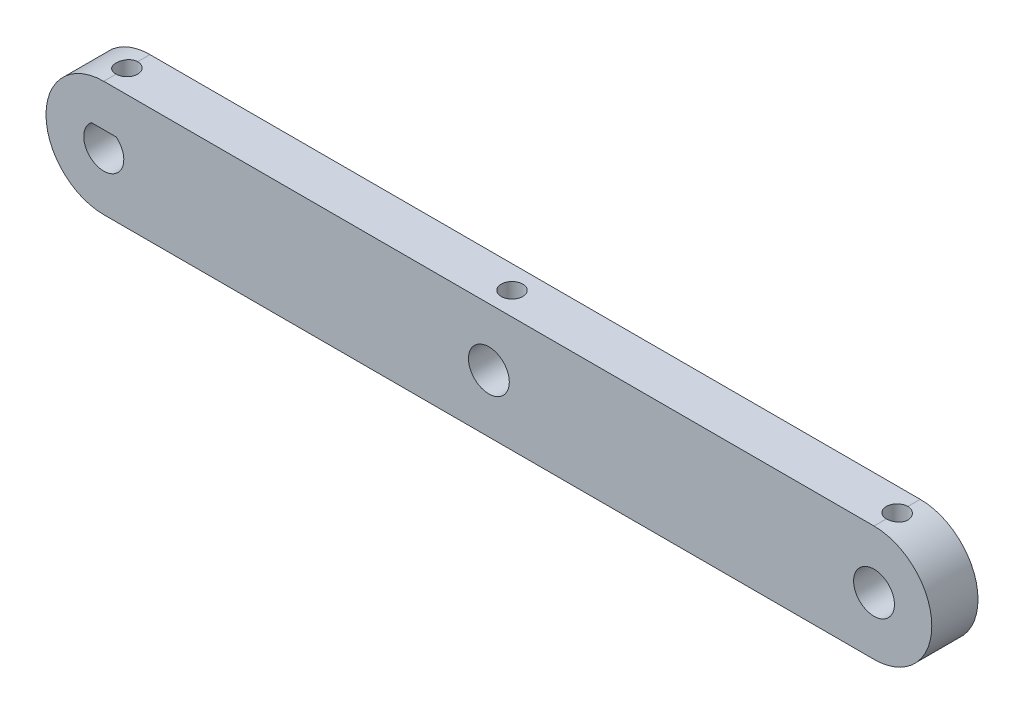
ISO-10303-21;
HEADER;
FILE_DESCRIPTION(('STEP AP214'),'2;1');
FILE_NAME('part.step','',(''),(''),'','','');
FILE_SCHEMA(('AUTOMOTIVE_DESIGN { 1 0 10303 214 1 1 1 1 }'));
ENDSEC;
DATA;
#1=APPLICATION_CONTEXT('core data for automotive mechanical design processes');
#2=APPLICATION_PROTOCOL_DEFINITION('international standard','automotive_design',2000,#1);
#3=PRODUCT_CONTEXT('',#1,'mechanical');
#4=PRODUCT('Part','Part','',(#3));
#5=PRODUCT_RELATED_PRODUCT_CATEGORY('part','',(#4));
#6=PRODUCT_DEFINITION_FORMATION('','',#4);
#7=PRODUCT_DEFINITION_CONTEXT('part definition',#1,'design');
#8=PRODUCT_DEFINITION('design','',#6,#7);
#9=PRODUCT_DEFINITION_SHAPE('','',#8);
#10=(LENGTH_UNIT() NAMED_UNIT(*) SI_UNIT(.MILLI.,.METRE.));
#11=(NAMED_UNIT(*) PLANE_ANGLE_UNIT() SI_UNIT($,.RADIAN.));
#12=(NAMED_UNIT(*) SI_UNIT($,.STERADIAN.) SOLID_ANGLE_UNIT());
#13=UNCERTAINTY_MEASURE_WITH_UNIT(LENGTH_MEASURE(1.E-05),#10,'distance_accuracy_value','');
#14=(GEOMETRIC_REPRESENTATION_CONTEXT(3) GLOBAL_UNCERTAINTY_ASSIGNED_CONTEXT((#13)) GLOBAL_UNIT_ASSIGNED_CONTEXT((#10,
#11,#12)) REPRESENTATION_CONTEXT('',''));
#15=CARTESIAN_POINT('',(0.,0.,0.));
#16=DIRECTION('',(0.,0.,1.));
#17=DIRECTION('',(1.,0.,0.));
#18=AXIS2_PLACEMENT_3D('',#15,#16,#17);
#19=CARTESIAN_POINT('',(0.,0.,6.));
#20=DIRECTION('',(0.,0.,1.));
#21=DIRECTION('',(1.,0.,0.));
#22=AXIS2_PLACEMENT_3D('',#19,#20,#21);
#23=PLANE('',#22);
#24=CARTESIAN_POINT('',(50.,0.,6.));
#25=DIRECTION('',(0.,0.,1.));
#26=DIRECTION('',(1.,0.,0.));
#27=AXIS2_PLACEMENT_3D('',#24,#25,#26);
#28=CIRCLE('',#27,2.65);
#29=CARTESIAN_POINT('',(52.65,0.,6.));
#30=VERTEX_POINT('',#29);
#31=EDGE_CURVE('E204',#30,#30,#28,.T.);
#32=ORIENTED_EDGE('',*,*,#31,.F.);
#33=EDGE_LOOP('',(#32));
#34=FACE_BOUND('',#33,.T.);
#35=CARTESIAN_POINT('',(0.,0.,6.));
#36=DIRECTION('',(0.,0.,1.));
#37=DIRECTION('',(1.,0.,0.));
#38=AXIS2_PLACEMENT_3D('',#35,#36,#37);
#39=CIRCLE('',#38,7.5);
#40=CARTESIAN_POINT('',(0.,7.5,6.));
#41=VERTEX_POINT('',#40);
#42=CARTESIAN_POINT('',(0.,-7.5,6.));
#43=VERTEX_POINT('',#42);
#44=EDGE_CURVE('E234',#41,#43,#39,.T.);
#45=ORIENTED_EDGE('',*,*,#44,.T.);
#46=DIRECTION('',(1.,0.,0.));
#47=VECTOR('',#46,1.);
#48=CARTESIAN_POINT('',(0.,-7.5,6.));
#49=LINE('',#48,#47);
#50=CARTESIAN_POINT('',(100.,-7.5,6.));
#51=VERTEX_POINT('',#50);
#52=EDGE_CURVE('E237',#43,#51,#49,.T.);
#53=ORIENTED_EDGE('',*,*,#52,.T.);
#54=CARTESIAN_POINT('',(100.,0.,6.));
#55=DIRECTION('',(0.,0.,1.));
#56=DIRECTION('',(1.,0.,0.));
#57=AXIS2_PLACEMENT_3D('',#54,#55,#56);
#58=CIRCLE('',#57,7.5);
#59=CARTESIAN_POINT('',(100.,7.5,6.));
#60=VERTEX_POINT('',#59);
#61=EDGE_CURVE('E240',#51,#60,#58,.T.);
#62=ORIENTED_EDGE('',*,*,#61,.T.);
#63=DIRECTION('',(-1.,0.,0.));
#64=VECTOR('',#63,1.);
#65=CARTESIAN_POINT('',(0.,7.5,6.));
#66=LINE('',#65,#64);
#67=EDGE_CURVE('E121',#60,#41,#66,.T.);
#68=ORIENTED_EDGE('',*,*,#67,.T.);
#69=EDGE_LOOP('',(#45,#53,#62,#68));
#70=FACE_BOUND('',#69,.T.);
#71=DIRECTION('',(-1.,0.,0.));
#72=VECTOR('',#71,1.);
#73=CARTESIAN_POINT('',(-1.59921855917195,2.05,6.));
#74=LINE('',#73,#72);
#75=CARTESIAN_POINT('',(1.59921855917195,2.05,6.));
#76=VERTEX_POINT('',#75);
#77=CARTESIAN_POINT('',(-1.59921855917195,2.05,6.));
#78=VERTEX_POINT('',#77);
#79=EDGE_CURVE('E220',#76,#78,#74,.T.);
#80=ORIENTED_EDGE('',*,*,#79,.F.);
#81=CARTESIAN_POINT('',(0.,0.,6.));
#82=DIRECTION('',(0.,0.,1.));
#83=DIRECTION('',(1.,0.,0.));
#84=AXIS2_PLACEMENT_3D('',#81,#82,#83);
#85=CIRCLE('',#84,2.6);
#86=EDGE_CURVE('E217',#78,#76,#85,.T.);
#87=ORIENTED_EDGE('',*,*,#86,.F.);
#88=EDGE_LOOP('',(#80,#87));
#89=FACE_BOUND('',#88,.T.);
#90=CARTESIAN_POINT('',(100.,0.,6.));
#91=DIRECTION('',(0.,0.,1.));
#92=DIRECTION('',(1.,0.,0.));
#93=AXIS2_PLACEMENT_3D('',#90,#91,#92);
#94=CIRCLE('',#93,2.65);
#95=CARTESIAN_POINT('',(102.65,0.,6.));
#96=VERTEX_POINT('',#95);
#97=EDGE_CURVE('E209',#96,#96,#94,.T.);
#98=ORIENTED_EDGE('',*,*,#97,.F.);
#99=EDGE_LOOP('',(#98));
#100=FACE_BOUND('',#99,.T.);
#101=ADVANCED_FACE('F35',(#34,#70,#89,#100),#23,.T.);
#102=CARTESIAN_POINT('',(0.,0.,0.));
#103=DIRECTION('',(0.,0.,1.));
#104=DIRECTION('',(1.,0.,0.));
#105=AXIS2_PLACEMENT_3D('',#102,#103,#104);
#106=PLANE('',#105);
#107=CARTESIAN_POINT('',(0.,0.,0.));
#108=DIRECTION('',(0.,0.,1.));
#109=DIRECTION('',(1.,0.,0.));
#110=AXIS2_PLACEMENT_3D('',#107,#108,#109);
#111=CIRCLE('',#110,7.5);
#112=CARTESIAN_POINT('',(0.,7.5,0.));
#113=VERTEX_POINT('',#112);
#114=CARTESIAN_POINT('',(0.,-7.5,0.));
#115=VERTEX_POINT('',#114);
#116=EDGE_CURVE('E233',#113,#115,#111,.T.);
#117=ORIENTED_EDGE('',*,*,#116,.F.);
#118=DIRECTION('',(-1.,0.,0.));
#119=VECTOR('',#118,1.);
#120=CARTESIAN_POINT('',(0.,7.5,0.));
#121=LINE('',#120,#119);
#122=CARTESIAN_POINT('',(100.,7.5,0.));
#123=VERTEX_POINT('',#122);
#124=EDGE_CURVE('E238',#123,#113,#121,.T.);
#125=ORIENTED_EDGE('',*,*,#124,.F.);
#126=CARTESIAN_POINT('',(100.,0.,0.));
#127=DIRECTION('',(0.,0.,1.));
#128=DIRECTION('',(1.,0.,0.));
#129=AXIS2_PLACEMENT_3D('',#126,#127,#128);
#130=CIRCLE('',#129,7.5);
#131=CARTESIAN_POINT('',(100.,-7.5,0.));
#132=VERTEX_POINT('',#131);
#133=EDGE_CURVE('E248',#132,#123,#130,.T.);
#134=ORIENTED_EDGE('',*,*,#133,.F.);
#135=DIRECTION('',(1.,0.,0.));
#136=VECTOR('',#135,1.);
#137=CARTESIAN_POINT('',(0.,-7.5,0.));
#138=LINE('',#137,#136);
#139=EDGE_CURVE('E246',#115,#132,#138,.T.);
#140=ORIENTED_EDGE('',*,*,#139,.F.);
#141=EDGE_LOOP('',(#117,#125,#134,#140));
#142=FACE_BOUND('',#141,.T.);
#143=CARTESIAN_POINT('',(0.,0.,0.));
#144=DIRECTION('',(0.,0.,1.));
#145=DIRECTION('',(1.,0.,0.));
#146=AXIS2_PLACEMENT_3D('',#143,#144,#145);
#147=CIRCLE('',#146,2.6);
#148=CARTESIAN_POINT('',(-1.59921855917195,2.05,0.));
#149=VERTEX_POINT('',#148);
#150=CARTESIAN_POINT('',(1.59921855917195,2.05,0.));
#151=VERTEX_POINT('',#150);
#152=EDGE_CURVE('E211',#149,#151,#147,.T.);
#153=ORIENTED_EDGE('',*,*,#152,.T.);
#154=DIRECTION('',(-1.,0.,0.));
#155=VECTOR('',#154,1.);
#156=CARTESIAN_POINT('',(-1.59921855917195,2.05,0.));
#157=LINE('',#156,#155);
#158=EDGE_CURVE('E221',#151,#149,#157,.T.);
#159=ORIENTED_EDGE('',*,*,#158,.T.);
#160=EDGE_LOOP('',(#153,#159));
#161=FACE_BOUND('',#160,.T.);
#162=CARTESIAN_POINT('',(50.,0.,0.));
#163=DIRECTION('',(0.,0.,1.));
#164=DIRECTION('',(1.,0.,0.));
#165=AXIS2_PLACEMENT_3D('',#162,#163,#164);
#166=CIRCLE('',#165,2.65);
#167=CARTESIAN_POINT('',(52.65,0.,0.));
#168=VERTEX_POINT('',#167);
#169=EDGE_CURVE('E207',#168,#168,#166,.T.);
#170=ORIENTED_EDGE('',*,*,#169,.T.);
#171=EDGE_LOOP('',(#170));
#172=FACE_BOUND('',#171,.T.);
#173=CARTESIAN_POINT('',(100.,0.,0.));
#174=DIRECTION('',(0.,0.,1.));
#175=DIRECTION('',(1.,0.,0.));
#176=AXIS2_PLACEMENT_3D('',#173,#174,#175);
#177=CIRCLE('',#176,2.65);
#178=CARTESIAN_POINT('',(102.65,0.,0.));
#179=VERTEX_POINT('',#178);
#180=EDGE_CURVE('E214',#179,#179,#177,.T.);
#181=ORIENTED_EDGE('',*,*,#180,.T.);
#182=EDGE_LOOP('',(#181));
#183=FACE_BOUND('',#182,.T.);
#184=ADVANCED_FACE('F172',(#142,#161,#172,#183),#106,.F.);
#185=CARTESIAN_POINT('',(0.,0.,6.));
#186=DIRECTION('',(0.,0.,-1.));
#187=DIRECTION('',(-1.,0.,0.));
#188=AXIS2_PLACEMENT_3D('',#185,#186,#187);
#189=CYLINDRICAL_SURFACE('',#188,7.5);
#190=DIRECTION('',(0.,0.,-1.));
#191=VECTOR('',#190,1.);
#192=CARTESIAN_POINT('',(0.,7.5,6.));
#193=LINE('',#192,#191);
#194=CARTESIAN_POINT('',(0.,7.5,4.4));
#195=VERTEX_POINT('',#194);
#196=EDGE_CURVE('E125',#41,#195,#193,.T.);
#197=ORIENTED_EDGE('',*,*,#196,.T.);
#198=CARTESIAN_POINT('',(0.,7.5,4.4));
#199=CARTESIAN_POINT('',(-0.0390274999976499,7.50000168804617,4.40000013119761));
#200=CARTESIAN_POINT('',(-0.0780359815357923,7.4996949913108,4.3983670238176));
#201=CARTESIAN_POINT('',(-0.155767349308247,7.49848276478008,4.39185447316173));
#202=CARTESIAN_POINT('',(-0.194490266411642,7.49757730069924,4.38697538613062));
#203=CARTESIAN_POINT('',(-0.309696879579772,7.49399500685883,4.36752843028375));
#204=CARTESIAN_POINT('',(-0.385398631671697,7.49045211389608,4.34815065171701));
#205=CARTESIAN_POINT('',(-0.532403242438511,7.48144288059134,4.2971545713793));
#206=CARTESIAN_POINT('',(-0.603705331980415,7.47597620505408,4.2655341363808));
#207=CARTESIAN_POINT('',(-0.740007583172991,7.46371708596287,4.1909746874556));
#208=CARTESIAN_POINT('',(-0.805007402207591,7.45692457039151,4.14803505864463));
#209=CARTESIAN_POINT('',(-0.927604447093402,7.44267464421018,4.05152327690213));
#210=CARTESIAN_POINT('',(-0.985116605090962,7.4352109906933,3.99784402305279));
#211=CARTESIAN_POINT('',(-1.09038022546929,7.4205055153701,3.88160081690617));
#212=CARTESIAN_POINT('',(-1.13813010014139,7.41326372981027,3.81903542219308));
#213=CARTESIAN_POINT('',(-1.22286206771817,7.39976149135296,3.68619424365165));
#214=CARTESIAN_POINT('',(-1.2597570125656,7.39350915760948,3.61586197658269));
#215=CARTESIAN_POINT('',(-1.32117238649656,7.38278278076284,3.46986517030981));
#216=CARTESIAN_POINT('',(-1.34569456604906,7.37830848612603,3.39420138712312));
#217=CARTESIAN_POINT('',(-1.38139603851032,7.37170767661482,3.24060382808613));
#218=CARTESIAN_POINT('',(-1.3927249546884,7.36955485533776,3.16270598282399));
#219=CARTESIAN_POINT('',(-1.40218279335013,7.36776140980787,3.00608584187921));
#220=CARTESIAN_POINT('',(-1.40031257809654,7.36812062145086,2.92736360038759));
#221=CARTESIAN_POINT('',(-1.38354610547339,7.37128679277393,2.77241673073362));
#222=CARTESIAN_POINT('',(-1.3688202578307,7.37406172911635,2.69617291188211));
#223=CARTESIAN_POINT('',(-1.32702896756523,7.38169636604965,2.54725788838299));
#224=CARTESIAN_POINT('',(-1.29996309000528,7.38655614012242,2.47458680976035));
#225=CARTESIAN_POINT('',(-1.23409266338776,7.39784649949702,2.33437932933584));
#226=CARTESIAN_POINT('',(-1.19521902754622,7.40428628556724,2.26687615666765));
#227=CARTESIAN_POINT('',(-1.10688667477699,7.41800467571309,2.1392890540703));
#228=CARTESIAN_POINT('',(-1.05742725633321,7.4252833353658,2.07920561626068));
#229=CARTESIAN_POINT('',(-0.94841556419234,7.43999819908092,1.96718336319144));
#230=CARTESIAN_POINT('',(-0.888718731998165,7.44743509636886,1.91538522680878));
#231=CARTESIAN_POINT('',(-0.761388123774441,7.46152688493838,1.82250351068201));
#232=CARTESIAN_POINT('',(-0.693752169390774,7.4681815605851,1.78142288164246));
#233=CARTESIAN_POINT('',(-0.552307664371813,7.47997333910093,1.71112125150246));
#234=CARTESIAN_POINT('',(-0.478488293143395,7.48510770721828,1.68192158719338));
#235=CARTESIAN_POINT('',(-0.32692419692711,7.49325371193639,1.6364164710319));
#236=CARTESIAN_POINT('',(-0.249185473878544,7.49626849455599,1.6200919047637));
#237=CARTESIAN_POINT('',(-0.142365098280794,7.49870293620568,1.60696304271927));
#238=CARTESIAN_POINT('',(-0.113931832544795,7.49918889082045,1.60435090177688));
#239=CARTESIAN_POINT('',(-0.0570032623682736,7.49983711772854,1.60087161096968));
#240=CARTESIAN_POINT('',(-0.028508143985088,7.49999993566455,1.60000151949013));
#241=CARTESIAN_POINT('',(0.,7.5,1.6));
#242=B_SPLINE_CURVE_WITH_KNOTS('',3,(#198,#199,#200,#201,#202,#203,#204,#205,#206,#207,#208,
#209,#210,#211,#212,#213,#214,#215,#216,#217,#218,#219,#220,#221,#222,#223,#224,#225,#226,#227,
#228,#229,#230,#231,#232,#233,#234,#235,#236,#237,#238,#239,#240,#241),.UNSPECIFIED.,.F.,.F.,(4,
2,2,2,2,2,2,2,2,2,2,2,2,2,2,2,2,2,2,2,2,4),(0.,0.117009549620378,0.234006259614957,
0.467466068989754,0.700966576001661,0.934479769905206,1.17044949644583,1.40645756992385,
1.64431171812681,1.88213220585648,2.11722849282898,2.35230942175344,2.58432072187484,
2.81634020010742,3.04974425673642,3.28316378576181,3.5202013683711,3.75730414258744,
3.99483086533484,4.23200428778688,4.31763371093321,4.40311841836402),.UNSPECIFIED.);
#243=CARTESIAN_POINT('',(0.,7.5,1.6));
#244=VERTEX_POINT('',#243);
#245=EDGE_CURVE('E59',#195,#244,#242,.T.);
#246=ORIENTED_EDGE('',*,*,#245,.T.);
#247=EDGE_CURVE('E243',#244,#113,#193,.T.);
#248=ORIENTED_EDGE('',*,*,#247,.T.);
#249=ORIENTED_EDGE('',*,*,#116,.T.);
#250=DIRECTION('',(0.,0.,-1.));
#251=VECTOR('',#250,1.);
#252=CARTESIAN_POINT('',(0.,-7.5,6.));
#253=LINE('',#252,#251);
#254=EDGE_CURVE('E11',#43,#115,#253,.T.);
#255=ORIENTED_EDGE('',*,*,#254,.F.);
#256=ORIENTED_EDGE('',*,*,#44,.F.);
#257=EDGE_LOOP('',(#197,#246,#248,#249,#255,#256));
#258=FACE_BOUND('',#257,.T.);
#259=ADVANCED_FACE('F37',(#258),#189,.T.);
#260=CARTESIAN_POINT('',(0.,-7.5,6.));
#261=DIRECTION('',(0.,1.,0.));
#262=DIRECTION('',(0.,0.,1.));
#263=AXIS2_PLACEMENT_3D('',#260,#261,#262);
#264=PLANE('',#263);
#265=ORIENTED_EDGE('',*,*,#139,.T.);
#266=DIRECTION('',(0.,0.,-1.));
#267=VECTOR('',#266,1.);
#268=CARTESIAN_POINT('',(100.,-7.5,6.));
#269=LINE('',#268,#267);
#270=EDGE_CURVE('E45',#51,#132,#269,.T.);
#271=ORIENTED_EDGE('',*,*,#270,.F.);
#272=ORIENTED_EDGE('',*,*,#52,.F.);
#273=ORIENTED_EDGE('',*,*,#254,.T.);
#274=EDGE_LOOP('',(#265,#271,#272,#273));
#275=FACE_BOUND('',#274,.T.);
#276=ADVANCED_FACE('F165',(#275),#264,.F.);
#277=CARTESIAN_POINT('',(100.,0.,6.));
#278=DIRECTION('',(0.,0.,-1.));
#279=DIRECTION('',(-1.,0.,0.));
#280=AXIS2_PLACEMENT_3D('',#277,#278,#279);
#281=CYLINDRICAL_SURFACE('',#280,7.5);
#282=DIRECTION('',(0.,0.,-1.));
#283=VECTOR('',#282,1.);
#284=CARTESIAN_POINT('',(100.,7.5,6.));
#285=LINE('',#284,#283);
#286=CARTESIAN_POINT('',(100.,7.5,1.6));
#287=VERTEX_POINT('',#286);
#288=EDGE_CURVE('E114',#287,#123,#285,.T.);
#289=ORIENTED_EDGE('',*,*,#288,.F.);
#290=CARTESIAN_POINT('',(100.,7.5,1.6));
#291=CARTESIAN_POINT('',(100.039027499998,7.50000168804617,1.59999986880239));
#292=CARTESIAN_POINT('',(100.078035981536,7.4996949913108,1.60163297618239));
#293=CARTESIAN_POINT('',(100.155767349308,7.49848276478008,1.60814552683827));
#294=CARTESIAN_POINT('',(100.194490266412,7.49757730069924,1.61302461386938));
#295=CARTESIAN_POINT('',(100.30969687958,7.49399500685883,1.63247156971625));
#296=CARTESIAN_POINT('',(100.385398631672,7.49045211389608,1.65184934828299));
#297=CARTESIAN_POINT('',(100.532403242439,7.48144288059134,1.7028454286207));
#298=CARTESIAN_POINT('',(100.60370533198,7.47597620505408,1.73446586361919));
#299=CARTESIAN_POINT('',(100.740007583173,7.46371708596287,1.8090253125444));
#300=CARTESIAN_POINT('',(100.805007402208,7.45692457039151,1.85196494135537));
#301=CARTESIAN_POINT('',(100.927604447093,7.44267464421017,1.94847672309787));
#302=CARTESIAN_POINT('',(100.985116605091,7.4352109906933,2.00215597694721));
#303=CARTESIAN_POINT('',(101.090380225469,7.4205055153701,2.11839918309383));
#304=CARTESIAN_POINT('',(101.138130100141,7.41326372981027,2.18096457780691));
#305=CARTESIAN_POINT('',(101.222862067718,7.39976149135297,2.31380575634834));
#306=CARTESIAN_POINT('',(101.259757012566,7.39350915760948,2.38413802341731));
#307=CARTESIAN_POINT('',(101.321172386497,7.38278278076284,2.53013482969019));
#308=CARTESIAN_POINT('',(101.345694566049,7.37830848612603,2.60579861287687));
#309=CARTESIAN_POINT('',(101.38139603851,7.37170767661482,2.75939617191386));
#310=CARTESIAN_POINT('',(101.392724954688,7.36955485533776,2.83729401717601));
#311=CARTESIAN_POINT('',(101.40218279335,7.36776140980787,2.99391415812079));
#312=CARTESIAN_POINT('',(101.400312578097,7.36812062145086,3.07263639961241));
#313=CARTESIAN_POINT('',(101.383546105473,7.37128679277392,3.22758326926638));
#314=CARTESIAN_POINT('',(101.368820257831,7.37406172911635,3.30382708811789));
#315=CARTESIAN_POINT('',(101.327028967565,7.38169636604965,3.45274211161701));
#316=CARTESIAN_POINT('',(101.299963090005,7.38655614012242,3.52541319023965));
#317=CARTESIAN_POINT('',(101.234092663388,7.39784649949702,3.66562067066416));
#318=CARTESIAN_POINT('',(101.195219027546,7.40428628556724,3.73312384333235));
#319=CARTESIAN_POINT('',(101.106886674777,7.41800467571309,3.8607109459297));
#320=CARTESIAN_POINT('',(101.057427256333,7.4252833353658,3.92079438373932));
#321=CARTESIAN_POINT('',(100.948415564192,7.43999819908092,4.03281663680856));
#322=CARTESIAN_POINT('',(100.888718731998,7.44743509636886,4.08461477319122));
#323=CARTESIAN_POINT('',(100.761388123774,7.46152688493838,4.17749648931799));
#324=CARTESIAN_POINT('',(100.693752169391,7.4681815605851,4.21857711835754));
#325=CARTESIAN_POINT('',(100.552307664372,7.47997333910093,4.28887874849754));
#326=CARTESIAN_POINT('',(100.478488293143,7.48510770721828,4.31807841280662));
#327=CARTESIAN_POINT('',(100.326924196927,7.49325371193639,4.3635835289681));
#328=CARTESIAN_POINT('',(100.249185473879,7.49626849455599,4.37990809523631));
#329=CARTESIAN_POINT('',(100.142365098281,7.49870293620568,4.39303695728073));
#330=CARTESIAN_POINT('',(100.113931832545,7.49918889082045,4.39564909822312));
#331=CARTESIAN_POINT('',(100.057003262368,7.49983711772854,4.39912838903032));
#332=CARTESIAN_POINT('',(100.028508143985,7.49999993566455,4.39999848050987));
#333=CARTESIAN_POINT('',(100.,7.5,4.4));
#334=B_SPLINE_CURVE_WITH_KNOTS('',3,(#290,#291,#292,#293,#294,#295,#296,#297,#298,#299,#300,
#301,#302,#303,#304,#305,#306,#307,#308,#309,#310,#311,#312,#313,#314,#315,#316,#317,#318,#319,
#320,#321,#322,#323,#324,#325,#326,#327,#328,#329,#330,#331,#332,#333),.UNSPECIFIED.,.F.,.F.,(4,
2,2,2,2,2,2,2,2,2,2,2,2,2,2,2,2,2,2,2,2,4),(0.,0.117009549620375,0.234006259614965,
0.467466068989756,0.700966576001664,0.934479769905205,1.17044949644583,1.40645756992385,
1.64431171812681,1.88213220585648,2.11722849282898,2.35230942175345,2.58432072187484,
2.81634020010743,3.04974425673643,3.28316378576182,3.52020136837109,3.75730414258743,
3.99483086533485,4.23200428778689,4.31763371093321,4.40311841836404),.UNSPECIFIED.);
#335=CARTESIAN_POINT('',(100.,7.5,4.4));
#336=VERTEX_POINT('',#335);
#337=EDGE_CURVE('E52',#287,#336,#334,.T.);
#338=ORIENTED_EDGE('',*,*,#337,.T.);
#339=EDGE_CURVE('E111',#60,#336,#285,.T.);
#340=ORIENTED_EDGE('',*,*,#339,.F.);
#341=ORIENTED_EDGE('',*,*,#61,.F.);
#342=ORIENTED_EDGE('',*,*,#270,.T.);
#343=ORIENTED_EDGE('',*,*,#133,.T.);
#344=EDGE_LOOP('',(#289,#338,#340,#341,#342,#343));
#345=FACE_BOUND('',#344,.T.);
#346=ADVANCED_FACE('F109',(#345),#281,.T.);
#347=CARTESIAN_POINT('',(0.,7.5,6.));
#348=DIRECTION('',(0.,-1.,0.));
#349=DIRECTION('',(0.,0.,-1.));
#350=AXIS2_PLACEMENT_3D('',#347,#348,#349);
#351=PLANE('',#350);
#352=CARTESIAN_POINT('',(50.,7.5,3.));
#353=DIRECTION('',(0.,1.,0.));
#354=DIRECTION('',(0.,0.,1.));
#355=AXIS2_PLACEMENT_3D('',#352,#353,#354);
#356=CIRCLE('',#355,1.4);
#357=CARTESIAN_POINT('',(50.,7.5,4.4));
#358=VERTEX_POINT('',#357);
#359=EDGE_CURVE('E105',#358,#358,#356,.T.);
#360=ORIENTED_EDGE('',*,*,#359,.F.);
#361=EDGE_LOOP('',(#360));
#362=FACE_BOUND('',#361,.T.);
#363=ORIENTED_EDGE('',*,*,#247,.F.);
#364=CARTESIAN_POINT('',(0.,7.5,3.));
#365=DIRECTION('',(0.,1.,0.));
#366=DIRECTION('',(0.,0.,1.));
#367=AXIS2_PLACEMENT_3D('',#364,#365,#366);
#368=CIRCLE('',#367,1.4);
#369=EDGE_CURVE('E135',#195,#244,#368,.T.);
#370=ORIENTED_EDGE('',*,*,#369,.F.);
#371=ORIENTED_EDGE('',*,*,#196,.F.);
#372=ORIENTED_EDGE('',*,*,#67,.F.);
#373=ORIENTED_EDGE('',*,*,#339,.T.);
#374=CARTESIAN_POINT('',(100.,7.5,3.));
#375=DIRECTION('',(0.,1.,0.));
#376=DIRECTION('',(0.,0.,1.));
#377=AXIS2_PLACEMENT_3D('',#374,#375,#376);
#378=CIRCLE('',#377,1.4);
#379=EDGE_CURVE('E100',#287,#336,#378,.T.);
#380=ORIENTED_EDGE('',*,*,#379,.F.);
#381=ORIENTED_EDGE('',*,*,#288,.T.);
#382=ORIENTED_EDGE('',*,*,#124,.T.);
#383=EDGE_LOOP('',(#363,#370,#371,#372,#373,#380,#381,#382));
#384=FACE_BOUND('',#383,.T.);
#385=ADVANCED_FACE('F119',(#362,#384),#351,.F.);
#386=CARTESIAN_POINT('',(0.,0.,6.));
#387=DIRECTION('',(0.,0.,-1.));
#388=DIRECTION('',(-1.,0.,0.));
#389=AXIS2_PLACEMENT_3D('',#386,#387,#388);
#390=CYLINDRICAL_SURFACE('',#389,2.6);
#391=ORIENTED_EDGE('',*,*,#152,.F.);
#392=DIRECTION('',(0.,0.,-1.));
#393=VECTOR('',#392,1.);
#394=CARTESIAN_POINT('',(-1.59921855917195,2.05,6.));
#395=LINE('',#394,#393);
#396=EDGE_CURVE('E223',#78,#149,#395,.T.);
#397=ORIENTED_EDGE('',*,*,#396,.F.);
#398=ORIENTED_EDGE('',*,*,#86,.T.);
#399=DIRECTION('',(0.,0.,-1.));
#400=VECTOR('',#399,1.);
#401=CARTESIAN_POINT('',(1.59921855917195,2.05,6.));
#402=LINE('',#401,#400);
#403=EDGE_CURVE('E230',#76,#151,#402,.T.);
#404=ORIENTED_EDGE('',*,*,#403,.T.);
#405=EDGE_LOOP('',(#391,#397,#398,#404));
#406=FACE_BOUND('',#405,.T.);
#407=ADVANCED_FACE('F184',(#406),#390,.F.);
#408=CARTESIAN_POINT('',(-1.59921855917195,2.05,6.));
#409=DIRECTION('',(0.,-1.,0.));
#410=DIRECTION('',(0.,0.,-1.));
#411=AXIS2_PLACEMENT_3D('',#408,#409,#410);
#412=PLANE('',#411);
#413=CARTESIAN_POINT('',(0.,2.05,3.));
#414=DIRECTION('',(0.,-1.,0.));
#415=DIRECTION('',(0.,0.,-1.));
#416=AXIS2_PLACEMENT_3D('',#413,#414,#415);
#417=CIRCLE('',#416,1.4);
#418=CARTESIAN_POINT('',(0.,2.05,1.6));
#419=VERTEX_POINT('',#418);
#420=EDGE_CURVE('E40',#419,#419,#417,.T.);
#421=ORIENTED_EDGE('',*,*,#420,.F.);
#422=EDGE_LOOP('',(#421));
#423=FACE_BOUND('',#422,.T.);
#424=ORIENTED_EDGE('',*,*,#158,.F.);
#425=ORIENTED_EDGE('',*,*,#403,.F.);
#426=ORIENTED_EDGE('',*,*,#79,.T.);
#427=ORIENTED_EDGE('',*,*,#396,.T.);
#428=EDGE_LOOP('',(#424,#425,#426,#427));
#429=FACE_BOUND('',#428,.T.);
#430=ADVANCED_FACE('F187',(#423,#429),#412,.T.);
#431=CARTESIAN_POINT('',(50.,0.,6.));
#432=DIRECTION('',(0.,0.,-1.));
#433=DIRECTION('',(-1.,0.,0.));
#434=AXIS2_PLACEMENT_3D('',#431,#432,#433);
#435=CYLINDRICAL_SURFACE('',#434,2.65);
#436=CARTESIAN_POINT('',(50.,2.65,4.4));
#437=CARTESIAN_POINT('',(49.9269081403906,2.64999577189303,4.39999524176111));
#438=CARTESIAN_POINT('',(49.8537445765438,2.6469444475611,4.39424260152883));
#439=CARTESIAN_POINT('',(49.7096119068125,2.63503837184261,4.3715018714453));
#440=CARTESIAN_POINT('',(49.6386465107375,2.62617431564432,4.35449576705632));
#441=CARTESIAN_POINT('',(49.5012082543877,2.60356279429746,4.31011494643922));
#442=CARTESIAN_POINT('',(49.4347185653846,2.58983499707556,4.28278196078171));
#443=CARTESIAN_POINT('',(49.3073856518219,2.55872773439076,4.2187572053212));
#444=CARTESIAN_POINT('',(49.2465423848026,2.54134829639052,4.18206550590125));
#445=CARTESIAN_POINT('',(49.1277643524775,2.50316723503044,4.09765875760169));
#446=CARTESIAN_POINT('',(49.0702785608017,2.48221629217821,4.04938056624456));
#447=CARTESIAN_POINT('',(48.9637990222122,2.43968873145059,3.94439701933113));
#448=CARTESIAN_POINT('',(48.9148125617519,2.41811159505586,3.88768450964544));
#449=CARTESIAN_POINT('',(48.822328378407,2.37453775382691,3.7614101036522));
#450=CARTESIAN_POINT('',(48.7797080603177,2.35267483312807,3.69115366032995));
#451=CARTESIAN_POINT('',(48.7070625727033,2.3135525668825,3.54321993357597));
#452=CARTESIAN_POINT('',(48.6770277594997,2.29628970023809,3.4655483882303));
#453=CARTESIAN_POINT('',(48.6324742902699,2.27002415678521,3.30985385551541));
#454=CARTESIAN_POINT('',(48.6171064157074,2.26057432078803,3.23215349314896));
#455=CARTESIAN_POINT('',(48.5997643106829,2.24987925007335,3.07475282510323));
#456=CARTESIAN_POINT('',(48.5977737872781,2.24862403477205,2.99505507099948));
#457=CARTESIAN_POINT('',(48.6066229597516,2.25410933012106,2.84772984004957));
#458=CARTESIAN_POINT('',(48.6157377921354,2.2597751927794,2.77994815781997));
#459=CARTESIAN_POINT('',(48.6435153027375,2.2765566304977,2.64707156044371));
#460=CARTESIAN_POINT('',(48.6621816842808,2.287674319269,2.58197769800497));
#461=CARTESIAN_POINT('',(48.7088283996693,2.31432656129897,2.4544795937693));
#462=CARTESIAN_POINT('',(48.7370102879698,2.32995553133549,2.39216977952225));
#463=CARTESIAN_POINT('',(48.8017241977777,2.36388852953691,2.27285004364525));
#464=CARTESIAN_POINT('',(48.8382599385483,2.38219374789574,2.21584249861835));
#465=CARTESIAN_POINT('',(48.9247543097965,2.4225887191349,2.10011821450481));
#466=CARTESIAN_POINT('',(48.975887552008,2.44484421427181,2.04233402857929));
#467=CARTESIAN_POINT('',(49.0871456630727,2.48852782533097,1.93574617149693));
#468=CARTESIAN_POINT('',(49.1472757898926,2.5099554481519,1.88694778928097));
#469=CARTESIAN_POINT('',(49.2791513204041,2.5510604959837,1.79704540518226));
#470=CARTESIAN_POINT('',(49.3513654060094,2.57056678984465,1.75654406366821));
#471=CARTESIAN_POINT('',(49.5028675025896,2.60410400229213,1.68861390621094));
#472=CARTESIAN_POINT('',(49.5821492307402,2.61813972549898,1.66117361447435));
#473=CARTESIAN_POINT('',(49.7379937039373,2.63808012290498,1.62260661843067));
#474=CARTESIAN_POINT('',(49.8141720174337,2.64459650653073,1.61024693591594));
#475=CARTESIAN_POINT('',(49.9677855496516,2.65091645362864,1.59825570471418));
#476=CARTESIAN_POINT('',(50.0452200386877,2.65072378387182,1.59861701387885));
#477=CARTESIAN_POINT('',(50.1918242376629,2.64397675761285,1.61142689185955));
#478=CARTESIAN_POINT('',(50.2611181194898,2.63798782831534,1.62280118155391));
#479=CARTESIAN_POINT('',(50.3966510703847,2.62103676693864,1.65555598861088));
#480=CARTESIAN_POINT('',(50.4628898181317,2.61007411306046,1.67693755585559));
#481=CARTESIAN_POINT('',(50.5924287165131,2.58379783303193,1.72955013965784));
#482=CARTESIAN_POINT('',(50.6556102576168,2.56838002370812,1.76101924968587));
#483=CARTESIAN_POINT('',(50.7759829983137,2.53461328949422,1.83262650503299));
#484=CARTESIAN_POINT('',(50.8331718068954,2.51626320198575,1.8727680911319));
#485=CARTESIAN_POINT('',(50.9464012063177,2.47604652213911,1.96547926554863));
#486=CARTESIAN_POINT('',(51.0016732402617,2.45401348390125,2.0189164465554));
#487=CARTESIAN_POINT('',(51.1028544471566,2.41024013166375,2.13420423331702));
#488=CARTESIAN_POINT('',(51.1487552802944,2.38850009434624,2.19606225223587));
#489=CARTESIAN_POINT('',(51.2327429741995,2.34631509039301,2.33135831083692));
#490=CARTESIAN_POINT('',(51.2701376065413,2.32604328478519,2.4052851980524));
#491=CARTESIAN_POINT('',(51.3315691589889,2.29143674897232,2.55976457829515));
#492=CARTESIAN_POINT('',(51.3556248950922,2.27709366296111,2.64030755338053));
#493=CARTESIAN_POINT('',(51.3873390617641,2.25789821215772,2.79736057830623));
#494=CARTESIAN_POINT('',(51.3963729297671,2.25225377482025,2.87349278998303));
#495=CARTESIAN_POINT('',(51.4018357046055,2.24886035736861,3.02636505716393));
#496=CARTESIAN_POINT('',(51.3982726302317,2.25110635446285,3.10310469496578));
#497=CARTESIAN_POINT('',(51.3799618570393,2.26236444301941,3.24544917249097));
#498=CARTESIAN_POINT('',(51.3665756700609,2.27055164671731,3.3113039381087));
#499=CARTESIAN_POINT('',(51.3308237810083,2.29168861433603,3.43971949891696));
#500=CARTESIAN_POINT('',(51.3084548363499,2.30464009791853,3.50227909538721));
#501=CARTESIAN_POINT('',(51.2537753020035,2.33486202766517,3.62687790044365));
#502=CARTESIAN_POINT('',(51.2209121318173,2.35235881689676,3.68861788258352));
#503=CARTESIAN_POINT('',(51.1467358661292,2.3893964443372,3.80612054376618));
#504=CARTESIAN_POINT('',(51.1054182209786,2.40893838033314,3.86187997973983));
#505=CARTESIAN_POINT('',(51.0086993452605,2.45115977849783,3.97403985647174));
#506=CARTESIAN_POINT('',(50.9521336631189,2.47389301885392,4.02942149158319));
#507=CARTESIAN_POINT('',(50.8300059033249,2.51749742659173,4.13020314349494));
#508=CARTESIAN_POINT('',(50.7644382164492,2.53836741948206,4.17559689049768));
#509=CARTESIAN_POINT('',(50.6241516306653,2.57649528539906,4.25582678211993));
#510=CARTESIAN_POINT('',(50.5492674773617,2.59366669442257,4.29041729598722));
#511=CARTESIAN_POINT('',(50.3936376824547,2.62178439623349,4.34604435588488));
#512=CARTESIAN_POINT('',(50.3129085266796,2.63274748310338,4.36711748839557));
#513=CARTESIAN_POINT('',(50.1927071746456,2.64326246221717,4.3872128105404));
#514=CARTESIAN_POINT('',(50.1543738171686,2.6457806383992,4.39199933675991));
#515=CARTESIAN_POINT('',(50.0773670085643,2.64915054054298,4.39839421786273));
#516=CARTESIAN_POINT('',(50.0386935516892,2.65000223828586,4.40000251892841));
#517=CARTESIAN_POINT('',(50.,2.65,4.4));
#518=B_SPLINE_CURVE_WITH_KNOTS('',3,(#436,#437,#438,#439,#440,#441,#442,#443,#444,#445,#446,
#447,#448,#449,#450,#451,#452,#453,#454,#455,#456,#457,#458,#459,#460,#461,#462,#463,#464,#465,
#466,#467,#468,#469,#470,#471,#472,#473,#474,#475,#476,#477,#478,#479,#480,#481,#482,#483,#484,
#485,#486,#487,#488,#489,#490,#491,#492,#493,#494,#495,#496,#497,#498,#499,#500,#501,#502,#503,
#504,#505,#506,#507,#508,#509,#510,#511,#512,#513,#514,#515,#516,#517),.UNSPECIFIED.,.T.,.F.,(4,
2,2,2,2,2,2,2,2,2,2,2,2,2,2,2,2,2,2,2,2,2,2,2,2,2,2,2,2,2,2,2,2,2,2,2,2,2,2,2,4),(0.,
0.219119335145641,0.438590287672512,0.657183690139112,0.875775448702988,1.10863333929338,
1.34168988238756,1.59550297771612,1.84912123082735,2.08695767966999,2.32450440306376,
2.52942052284981,2.73441615294619,2.94405904243753,3.15379545052858,3.39368492922544,
3.63371515591988,3.88752716071031,4.14111574582804,4.37216991478711,4.6030943614057,
4.81354917853091,5.02402607981335,5.23989023273336,5.45584018692455,5.69475025483677,
5.9338720205512,6.18836955055716,6.44250716422818,6.67174945475778,6.90084584361815,
7.10305912468036,7.3053454661416,7.52080580638226,7.73638239974193,7.98236435246788,
8.22850028014995,8.47988203856526,8.73058049746417,8.84657647568914,8.96257441808468),.UNSPECIFIED.);
#519=CARTESIAN_POINT('',(50.,2.65,4.4));
#520=VERTEX_POINT('',#519);
#521=EDGE_CURVE('E115',#520,#520,#518,.T.);
#522=ORIENTED_EDGE('',*,*,#521,.F.);
#523=EDGE_LOOP('',(#522));
#524=FACE_BOUND('',#523,.T.);
#525=ORIENTED_EDGE('',*,*,#31,.T.);
#526=EDGE_LOOP('',(#525));
#527=FACE_BOUND('',#526,.T.);
#528=ORIENTED_EDGE('',*,*,#169,.F.);
#529=EDGE_LOOP('',(#528));
#530=FACE_BOUND('',#529,.T.);
#531=ADVANCED_FACE('F190',(#524,#527,#530),#435,.F.);
#532=CARTESIAN_POINT('',(100.,0.,6.));
#533=DIRECTION('',(0.,0.,-1.));
#534=DIRECTION('',(-1.,0.,0.));
#535=AXIS2_PLACEMENT_3D('',#532,#533,#534);
#536=CYLINDRICAL_SURFACE('',#535,2.65);
#537=CARTESIAN_POINT('',(100.,2.65,4.4));
#538=CARTESIAN_POINT('',(99.9269081403906,2.64999577189303,4.39999524176112));
#539=CARTESIAN_POINT('',(99.8537445765438,2.6469444475611,4.39424260152884));
#540=CARTESIAN_POINT('',(99.7096119068125,2.63503837184261,4.37150187144531));
#541=CARTESIAN_POINT('',(99.6386465107375,2.62617431564432,4.35449576705633));
#542=CARTESIAN_POINT('',(99.5012082543877,2.60356279429746,4.31011494643923));
#543=CARTESIAN_POINT('',(99.4347185653847,2.58983499707556,4.28278196078172));
#544=CARTESIAN_POINT('',(99.3073856518219,2.55872773439075,4.21875720532121));
#545=CARTESIAN_POINT('',(99.2465423848026,2.54134829639052,4.18206550590125));
#546=CARTESIAN_POINT('',(99.1277643524775,2.50316723503044,4.0976587576017));
#547=CARTESIAN_POINT('',(99.0702785608017,2.48221629217821,4.04938056624457));
#548=CARTESIAN_POINT('',(98.9637990222122,2.43968873145059,3.94439701933114));
#549=CARTESIAN_POINT('',(98.9148125617519,2.41811159505586,3.88768450964545));
#550=CARTESIAN_POINT('',(98.822328378407,2.3745377538269,3.76141010365221));
#551=CARTESIAN_POINT('',(98.7797080603177,2.35267483312807,3.69115366032996));
#552=CARTESIAN_POINT('',(98.7070625727033,2.31355256688249,3.54321993357598));
#553=CARTESIAN_POINT('',(98.6770277594997,2.29628970023809,3.46554838823031));
#554=CARTESIAN_POINT('',(98.6324742902699,2.2700241567852,3.30985385551542));
#555=CARTESIAN_POINT('',(98.6171064157074,2.26057432078802,3.23215349314897));
#556=CARTESIAN_POINT('',(98.5997643106829,2.24987925007335,3.07475282510324));
#557=CARTESIAN_POINT('',(98.5977737872781,2.24862403477205,2.99505507099948));
#558=CARTESIAN_POINT('',(98.6066229597516,2.25410933012106,2.84772984004957));
#559=CARTESIAN_POINT('',(98.6157377921354,2.25977519277939,2.77994815781998));
#560=CARTESIAN_POINT('',(98.6435153027375,2.27655663049769,2.64707156044371));
#561=CARTESIAN_POINT('',(98.6621816842808,2.28767431926899,2.58197769800497));
#562=CARTESIAN_POINT('',(98.7088283996693,2.31432656129896,2.4544795937693));
#563=CARTESIAN_POINT('',(98.7370102879698,2.32995553133548,2.39216977952226));
#564=CARTESIAN_POINT('',(98.8017241977776,2.36388852953691,2.27285004364526));
#565=CARTESIAN_POINT('',(98.8382599385483,2.38219374789573,2.21584249861835));
#566=CARTESIAN_POINT('',(98.9247543097965,2.4225887191349,2.10011821450481));
#567=CARTESIAN_POINT('',(98.975887552008,2.44484421427181,2.04233402857929));
#568=CARTESIAN_POINT('',(99.0871456630727,2.48852782533097,1.93574617149693));
#569=CARTESIAN_POINT('',(99.1472757898926,2.50995544815189,1.88694778928097));
#570=CARTESIAN_POINT('',(99.2791513204041,2.5510604959837,1.79704540518226));
#571=CARTESIAN_POINT('',(99.3513654060094,2.57056678984465,1.75654406366821));
#572=CARTESIAN_POINT('',(99.5028675025896,2.60410400229213,1.68861390621094));
#573=CARTESIAN_POINT('',(99.5821492307402,2.61813972549898,1.66117361447435));
#574=CARTESIAN_POINT('',(99.7379937039373,2.63808012290498,1.62260661843067));
#575=CARTESIAN_POINT('',(99.8141720174337,2.64459650653073,1.61024693591593));
#576=CARTESIAN_POINT('',(99.9677855496516,2.65091645362864,1.59825570471417));
#577=CARTESIAN_POINT('',(100.045220038688,2.65072378387182,1.59861701387884));
#578=CARTESIAN_POINT('',(100.191824237663,2.64397675761285,1.61142689185954));
#579=CARTESIAN_POINT('',(100.26111811949,2.63798782831534,1.6228011815539));
#580=CARTESIAN_POINT('',(100.396651070385,2.62103676693864,1.65555598861087));
#581=CARTESIAN_POINT('',(100.462889818132,2.61007411306046,1.67693755585558));
#582=CARTESIAN_POINT('',(100.592428716513,2.58379783303193,1.72955013965783));
#583=CARTESIAN_POINT('',(100.655610257617,2.56838002370812,1.76101924968587));
#584=CARTESIAN_POINT('',(100.775982998314,2.53461328949422,1.83262650503299));
#585=CARTESIAN_POINT('',(100.833171806895,2.51626320198575,1.8727680911319));
#586=CARTESIAN_POINT('',(100.946401206318,2.47604652213911,1.96547926554863));
#587=CARTESIAN_POINT('',(101.001673240262,2.45401348390125,2.01891644655539));
#588=CARTESIAN_POINT('',(101.102854447157,2.41024013166375,2.13420423331701));
#589=CARTESIAN_POINT('',(101.148755280294,2.38850009434624,2.19606225223585));
#590=CARTESIAN_POINT('',(101.232742974199,2.34631509039302,2.3313583108369));
#591=CARTESIAN_POINT('',(101.270137606541,2.32604328478519,2.40528519805238));
#592=CARTESIAN_POINT('',(101.331569158989,2.29143674897232,2.55976457829513));
#593=CARTESIAN_POINT('',(101.355624895092,2.27709366296111,2.64030755338052));
#594=CARTESIAN_POINT('',(101.387339061764,2.25789821215772,2.79736057830622));
#595=CARTESIAN_POINT('',(101.396372929767,2.25225377482025,2.87349278998303));
#596=CARTESIAN_POINT('',(101.401835704605,2.24886035736861,3.02636505716393));
#597=CARTESIAN_POINT('',(101.398272630232,2.25110635446285,3.10310469496578));
#598=CARTESIAN_POINT('',(101.379961857039,2.2623644430194,3.24544917249096));
#599=CARTESIAN_POINT('',(101.366575670061,2.2705516467173,3.31130393810869));
#600=CARTESIAN_POINT('',(101.330823781008,2.29168861433602,3.43971949891696));
#601=CARTESIAN_POINT('',(101.30845483635,2.30464009791853,3.50227909538721));
#602=CARTESIAN_POINT('',(101.253775302004,2.33486202766517,3.62687790044365));
#603=CARTESIAN_POINT('',(101.220912131817,2.35235881689676,3.68861788258352));
#604=CARTESIAN_POINT('',(101.146735866129,2.3893964443372,3.80612054376618));
#605=CARTESIAN_POINT('',(101.105418220979,2.40893838033313,3.86187997973983));
#606=CARTESIAN_POINT('',(101.00869934526,2.45115977849783,3.97403985647174));
#607=CARTESIAN_POINT('',(100.952133663119,2.47389301885392,4.02942149158319));
#608=CARTESIAN_POINT('',(100.830005903325,2.51749742659173,4.13020314349495));
#609=CARTESIAN_POINT('',(100.764438216449,2.53836741948206,4.17559689049769));
#610=CARTESIAN_POINT('',(100.624151630665,2.57649528539906,4.25582678211993));
#611=CARTESIAN_POINT('',(100.549267477362,2.59366669442257,4.29041729598723));
#612=CARTESIAN_POINT('',(100.393637682455,2.62178439623349,4.34604435588489));
#613=CARTESIAN_POINT('',(100.31290852668,2.63274748310338,4.36711748839558));
#614=CARTESIAN_POINT('',(100.192707174646,2.64326246221717,4.38721281054041));
#615=CARTESIAN_POINT('',(100.154373817169,2.6457806383992,4.39199933675991));
#616=CARTESIAN_POINT('',(100.077367008564,2.64915054054298,4.39839421786274));
#617=CARTESIAN_POINT('',(100.038693551689,2.65000223828586,4.40000251892842));
#618=CARTESIAN_POINT('',(100.,2.65,4.4));
#619=B_SPLINE_CURVE_WITH_KNOTS('',3,(#537,#538,#539,#540,#541,#542,#543,#544,#545,#546,#547,
#548,#549,#550,#551,#552,#553,#554,#555,#556,#557,#558,#559,#560,#561,#562,#563,#564,#565,#566,
#567,#568,#569,#570,#571,#572,#573,#574,#575,#576,#577,#578,#579,#580,#581,#582,#583,#584,#585,
#586,#587,#588,#589,#590,#591,#592,#593,#594,#595,#596,#597,#598,#599,#600,#601,#602,#603,#604,
#605,#606,#607,#608,#609,#610,#611,#612,#613,#614,#615,#616,#617,#618),.UNSPECIFIED.,.T.,.F.,(4,
2,2,2,2,2,2,2,2,2,2,2,2,2,2,2,2,2,2,2,2,2,2,2,2,2,2,2,2,2,2,2,2,2,2,2,2,2,2,2,4),(0.,
0.219119335145634,0.438590287672512,0.657183690139113,0.875775448702978,1.10863333929339,
1.34168988238756,1.59550297771612,1.84912123082735,2.08695767966999,2.32450440306377,
2.52942052284981,2.7344161529462,2.94405904243754,3.1537954505286,3.39368492922546,
3.63371515591989,3.88752716071033,4.14111574582806,4.37216991478713,4.60309436140573,
4.81354917853093,5.02402607981337,5.23989023273339,5.45584018692458,5.69475025483679,
5.93387202055121,6.18836955055718,6.4425071642282,6.67174945475781,6.90084584361818,
7.10305912468039,7.30534546614164,7.5208058063823,7.73638239974196,7.98236435246791,
8.22850028014999,8.4798820385653,8.73058049746421,8.84657647568918,8.96257441808472),.UNSPECIFIED.);
#620=CARTESIAN_POINT('',(100.,2.65,4.4));
#621=VERTEX_POINT('',#620);
#622=EDGE_CURVE('E116',#621,#621,#619,.T.);
#623=ORIENTED_EDGE('',*,*,#622,.F.);
#624=EDGE_LOOP('',(#623));
#625=FACE_BOUND('',#624,.T.);
#626=ORIENTED_EDGE('',*,*,#97,.T.);
#627=EDGE_LOOP('',(#626));
#628=FACE_BOUND('',#627,.T.);
#629=ORIENTED_EDGE('',*,*,#180,.F.);
#630=EDGE_LOOP('',(#629));
#631=FACE_BOUND('',#630,.T.);
#632=ADVANCED_FACE('F141',(#625,#628,#631),#536,.F.);
#633=CARTESIAN_POINT('',(100.,-3.95979797464467,3.));
#634=DIRECTION('',(0.,1.,0.));
#635=DIRECTION('',(0.,0.,1.));
#636=AXIS2_PLACEMENT_3D('',#633,#634,#635);
#637=CYLINDRICAL_SURFACE('',#636,1.4);
#638=ORIENTED_EDGE('',*,*,#622,.T.);
#639=EDGE_LOOP('',(#638));
#640=FACE_BOUND('',#639,.T.);
#641=ORIENTED_EDGE('',*,*,#379,.T.);
#642=ORIENTED_EDGE('',*,*,#337,.F.);
#643=EDGE_LOOP('',(#641,#642));
#644=FACE_BOUND('',#643,.T.);
#645=ADVANCED_FACE('F101',(#640,#644),#637,.F.);
#646=CARTESIAN_POINT('',(50.,-3.95979797464467,3.));
#647=DIRECTION('',(0.,1.,0.));
#648=DIRECTION('',(0.,0.,1.));
#649=AXIS2_PLACEMENT_3D('',#646,#647,#648);
#650=CYLINDRICAL_SURFACE('',#649,1.4);
#651=ORIENTED_EDGE('',*,*,#521,.T.);
#652=EDGE_LOOP('',(#651));
#653=FACE_BOUND('',#652,.T.);
#654=ORIENTED_EDGE('',*,*,#359,.T.);
#655=EDGE_LOOP('',(#654));
#656=FACE_BOUND('',#655,.T.);
#657=ADVANCED_FACE('F145',(#653,#656),#650,.F.);
#658=CARTESIAN_POINT('',(0.,-3.95979797464467,3.));
#659=DIRECTION('',(0.,1.,0.));
#660=DIRECTION('',(0.,0.,1.));
#661=AXIS2_PLACEMENT_3D('',#658,#659,#660);
#662=CYLINDRICAL_SURFACE('',#661,1.4);
#663=ORIENTED_EDGE('',*,*,#420,.T.);
#664=EDGE_LOOP('',(#663));
#665=FACE_BOUND('',#664,.T.);
#666=ORIENTED_EDGE('',*,*,#369,.T.);
#667=ORIENTED_EDGE('',*,*,#245,.F.);
#668=EDGE_LOOP('',(#666,#667));
#669=FACE_BOUND('',#668,.T.);
#670=ADVANCED_FACE('F301',(#665,#669),#662,.F.);
#671=CLOSED_SHELL('',(#101,#184,#259,#276,#346,#385,#407,#430,#531,#632,#645,#657,#670));
#672=MANIFOLD_SOLID_BREP('B2',#671);
#673=ADVANCED_BREP_SHAPE_REPRESENTATION('',(#18,#672),#14);
#674=SHAPE_DEFINITION_REPRESENTATION(#9,#673);
ENDSEC;
END-ISO-10303-21;
